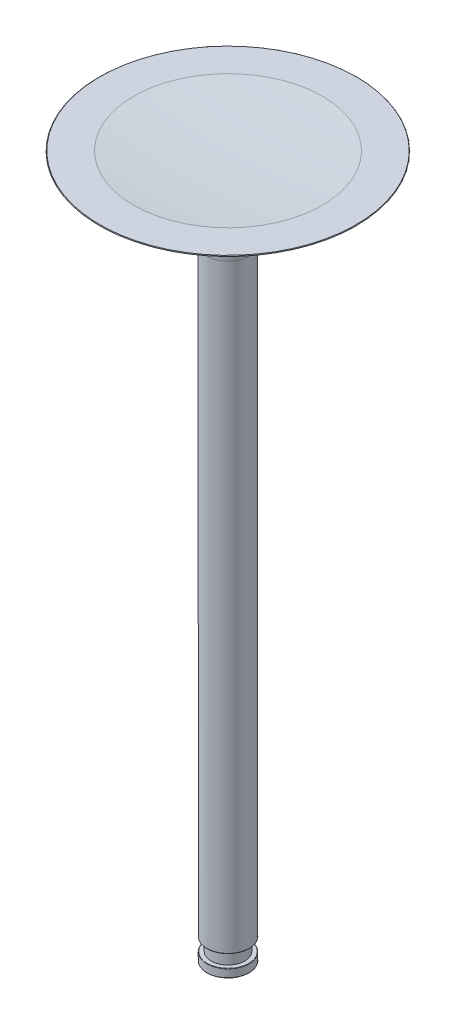
ISO-10303-21;
HEADER;
FILE_DESCRIPTION(('STEP AP214'),'2;1');
FILE_NAME('part.step','',(''),(''),'','','');
FILE_SCHEMA(('AUTOMOTIVE_DESIGN { 1 0 10303 214 1 1 1 1 }'));
ENDSEC;
DATA;
#1=APPLICATION_CONTEXT('core data for automotive mechanical design processes');
#2=APPLICATION_PROTOCOL_DEFINITION('international standard','automotive_design',2000,#1);
#3=PRODUCT_CONTEXT('',#1,'mechanical');
#4=PRODUCT('Part','Part','',(#3));
#5=PRODUCT_RELATED_PRODUCT_CATEGORY('part','',(#4));
#6=PRODUCT_DEFINITION_FORMATION('','',#4);
#7=PRODUCT_DEFINITION_CONTEXT('part definition',#1,'design');
#8=PRODUCT_DEFINITION('design','',#6,#7);
#9=PRODUCT_DEFINITION_SHAPE('','',#8);
#10=(LENGTH_UNIT() NAMED_UNIT(*) SI_UNIT(.MILLI.,.METRE.));
#11=(NAMED_UNIT(*) PLANE_ANGLE_UNIT() SI_UNIT($,.RADIAN.));
#12=(NAMED_UNIT(*) SI_UNIT($,.STERADIAN.) SOLID_ANGLE_UNIT());
#13=UNCERTAINTY_MEASURE_WITH_UNIT(LENGTH_MEASURE(1.E-05),#10,'distance_accuracy_value','');
#14=(GEOMETRIC_REPRESENTATION_CONTEXT(3) GLOBAL_UNCERTAINTY_ASSIGNED_CONTEXT((#13)) GLOBAL_UNIT_ASSIGNED_CONTEXT((#10,
#11,#12)) REPRESENTATION_CONTEXT('',''));
#15=CARTESIAN_POINT('',(0.,0.,0.));
#16=DIRECTION('',(0.,0.,1.));
#17=DIRECTION('',(1.,0.,0.));
#18=AXIS2_PLACEMENT_3D('',#15,#16,#17);
#19=CARTESIAN_POINT('',(0.,83.312,0.));
#20=DIRECTION('',(0.,-1.,0.));
#21=DIRECTION('',(0.,0.,-1.));
#22=AXIS2_PLACEMENT_3D('',#19,#20,#21);
#23=PLANE('',#22);
#24=CARTESIAN_POINT('',(0.,83.312,0.));
#25=DIRECTION('',(0.,-1.,0.));
#26=DIRECTION('',(0.,0.,-1.));
#27=AXIS2_PLACEMENT_3D('',#24,#25,#26);
#28=CIRCLE('',#27,15.2132739148693);
#29=CARTESIAN_POINT('',(0.,83.312,-15.2132739148693));
#30=VERTEX_POINT('',#29);
#31=EDGE_CURVE('E46',#30,#30,#28,.F.);
#32=ORIENTED_EDGE('',*,*,#31,.T.);
#33=EDGE_LOOP('',(#32));
#34=FACE_BOUND('',#33,.T.);
#35=CARTESIAN_POINT('',(0.,83.312,0.));
#36=DIRECTION('',(0.,-1.,0.));
#37=DIRECTION('',(0.,0.,-1.));
#38=AXIS2_PLACEMENT_3D('',#35,#36,#37);
#39=CIRCLE('',#38,11.2132739148693);
#40=CARTESIAN_POINT('',(0.,83.312,-11.2132739148693));
#41=VERTEX_POINT('',#40);
#42=EDGE_CURVE('E10',#41,#41,#39,.F.);
#43=ORIENTED_EDGE('',*,*,#42,.F.);
#44=EDGE_LOOP('',(#43));
#45=FACE_BOUND('',#44,.T.);
#46=ADVANCED_FACE('F38',(#34,#45),#23,.F.);
#47=CARTESIAN_POINT('',(-2.49999999999999,0.,0.));
#48=DIRECTION('',(0.,1.,0.));
#49=DIRECTION('',(0.,0.,1.));
#50=AXIS2_PLACEMENT_3D('',#47,#48,#49);
#51=PLANE('',#50);
#52=CARTESIAN_POINT('',(0.,0.,0.));
#53=DIRECTION('',(0.,1.,0.));
#54=DIRECTION('',(0.,0.,1.));
#55=AXIS2_PLACEMENT_3D('',#52,#53,#54);
#56=CIRCLE('',#55,2.44999999999999);
#57=CARTESIAN_POINT('',(0.,0.,2.44999999999999));
#58=VERTEX_POINT('',#57);
#59=EDGE_CURVE('E56',#58,#58,#56,.F.);
#60=ORIENTED_EDGE('',*,*,#59,.T.);
#61=EDGE_LOOP('',(#60));
#62=FACE_BOUND('',#61,.T.);
#63=ADVANCED_FACE('F110',(#62),#51,.F.);
#64=CARTESIAN_POINT('',(0.,208.799511889888,0.));
#65=DIRECTION('',(0.,0.,1.));
#66=DIRECTION('',(1.,0.,0.));
#67=AXIS2_PLACEMENT_3D('',#64,#65,#66);
#68=SPHERICAL_SURFACE('',#67,125.987511889888);
#69=CARTESIAN_POINT('',(0.,208.799511889888,0.));
#70=DIRECTION('',(0.,-1.,0.));
#71=DIRECTION('',(0.,0.,-1.));
#72=AXIS2_PLACEMENT_3D('',#69,#70,#71);
#73=SPHERICAL_SURFACE('',#72,125.987511889888);
#74=ORIENTED_EDGE('',*,*,#42,.T.);
#75=EDGE_LOOP('',(#74));
#76=FACE_BOUND('',#75,.T.);
#77=ADVANCED_FACE('F40',(#76),#73,.F.);
#78=CARTESIAN_POINT('',(0.,119.029206452911,0.));
#79=DIRECTION('',(0.,-1.,0.));
#80=DIRECTION('',(0.,0.,-1.));
#81=AXIS2_PLACEMENT_3D('',#78,#79,#80);
#82=DEGENERATE_TOROIDAL_SURFACE('',#81,2.50000000000001,38.0094572021208,.T.);
#83=CARTESIAN_POINT('',(0.,83.2148876213081,0.));
#84=DIRECTION('',(0.,1.,0.));
#85=DIRECTION('',(0.,0.,1.));
#86=AXIS2_PLACEMENT_3D('',#83,#84,#85);
#87=CIRCLE('',#86,15.2300197732824);
#88=CARTESIAN_POINT('',(0.,83.2148876213081,15.2300197732824));
#89=VERTEX_POINT('',#88);
#90=EDGE_CURVE('E52',#89,#89,#87,.F.);
#91=ORIENTED_EDGE('',*,*,#90,.T.);
#92=EDGE_LOOP('',(#91));
#93=FACE_BOUND('',#92,.T.);
#94=CARTESIAN_POINT('',(0.,81.5987349281267,0.));
#95=DIRECTION('',(0.,-1.,0.));
#96=DIRECTION('',(0.,0.,-1.));
#97=AXIS2_PLACEMENT_3D('',#94,#95,#96);
#98=CIRCLE('',#97,9.10898163351838);
#99=CARTESIAN_POINT('',(0.,81.5987349281267,-9.10898163351838));
#100=VERTEX_POINT('',#99);
#101=EDGE_CURVE('E76',#100,#100,#98,.T.);
#102=ORIENTED_EDGE('',*,*,#101,.F.);
#103=EDGE_LOOP('',(#102));
#104=FACE_BOUND('',#103,.T.);
#105=ADVANCED_FACE('F121',(#93,#104),#82,.T.);
#106=CARTESIAN_POINT('',(0.,73.7205963215706,0.));
#107=DIRECTION('',(0.,-1.,0.));
#108=DIRECTION('',(0.,0.,-1.));
#109=AXIS2_PLACEMENT_3D('',#106,#107,#108);
#110=TOROIDAL_SURFACE('',#109,10.5,8.);
#111=CARTESIAN_POINT('',(0.,73.7205963215706,0.));
#112=DIRECTION('',(0.,-1.,0.));
#113=DIRECTION('',(0.,0.,-1.));
#114=AXIS2_PLACEMENT_3D('',#111,#112,#113);
#115=CIRCLE('',#114,2.5);
#116=CARTESIAN_POINT('',(0.,73.7205963215706,-2.5));
#117=VERTEX_POINT('',#116);
#118=EDGE_CURVE('E79',#117,#117,#115,.T.);
#119=ORIENTED_EDGE('',*,*,#118,.F.);
#120=EDGE_LOOP('',(#119));
#121=FACE_BOUND('',#120,.T.);
#122=ORIENTED_EDGE('',*,*,#101,.T.);
#123=EDGE_LOOP('',(#122));
#124=FACE_BOUND('',#123,.T.);
#125=ADVANCED_FACE('F106',(#121,#124),#110,.F.);
#126=CARTESIAN_POINT('',(0.,0.,0.));
#127=DIRECTION('',(0.,-1.,0.));
#128=DIRECTION('',(0.,0.,-1.));
#129=AXIS2_PLACEMENT_3D('',#126,#127,#128);
#130=CYLINDRICAL_SURFACE('',#129,2.5);
#131=CARTESIAN_POINT('',(0.,2.55,0.));
#132=DIRECTION('',(0.,1.,0.));
#133=DIRECTION('',(0.,0.,1.));
#134=AXIS2_PLACEMENT_3D('',#131,#132,#133);
#135=CIRCLE('',#134,2.5);
#136=CARTESIAN_POINT('',(0.,2.55,2.5));
#137=VERTEX_POINT('',#136);
#138=EDGE_CURVE('E70',#137,#137,#135,.T.);
#139=ORIENTED_EDGE('',*,*,#138,.T.);
#140=EDGE_LOOP('',(#139));
#141=FACE_BOUND('',#140,.T.);
#142=ORIENTED_EDGE('',*,*,#118,.T.);
#143=EDGE_LOOP('',(#142));
#144=FACE_BOUND('',#143,.T.);
#145=ADVANCED_FACE('F99',(#141,#144),#130,.T.);
#146=CARTESIAN_POINT('',(-2.5,2.5,0.));
#147=DIRECTION('',(0.,1.,0.));
#148=DIRECTION('',(0.,0.,1.));
#149=AXIS2_PLACEMENT_3D('',#146,#147,#148);
#150=PLANE('',#149);
#151=CARTESIAN_POINT('',(0.,2.5,0.));
#152=DIRECTION('',(0.,1.,0.));
#153=DIRECTION('',(0.,0.,1.));
#154=AXIS2_PLACEMENT_3D('',#151,#152,#153);
#155=CIRCLE('',#154,2.45);
#156=CARTESIAN_POINT('',(0.,2.5,2.45));
#157=VERTEX_POINT('',#156);
#158=EDGE_CURVE('E73',#157,#157,#155,.F.);
#159=ORIENTED_EDGE('',*,*,#158,.T.);
#160=EDGE_LOOP('',(#159));
#161=FACE_BOUND('',#160,.T.);
#162=CARTESIAN_POINT('',(0.,2.5,0.));
#163=DIRECTION('',(0.,-1.,0.));
#164=DIRECTION('',(0.,0.,-1.));
#165=AXIS2_PLACEMENT_3D('',#162,#163,#164);
#166=CIRCLE('',#165,1.99999999999999);
#167=CARTESIAN_POINT('',(0.,2.5,-1.99999999999999));
#168=VERTEX_POINT('',#167);
#169=EDGE_CURVE('E82',#168,#168,#166,.T.);
#170=ORIENTED_EDGE('',*,*,#169,.F.);
#171=EDGE_LOOP('',(#170));
#172=FACE_BOUND('',#171,.T.);
#173=ADVANCED_FACE('F94',(#161,#172),#150,.F.);
#174=CARTESIAN_POINT('',(0.,0.,0.));
#175=DIRECTION('',(0.,-1.,0.));
#176=DIRECTION('',(0.,0.,-1.));
#177=AXIS2_PLACEMENT_3D('',#174,#175,#176);
#178=CYLINDRICAL_SURFACE('',#177,1.99999999999999);
#179=CARTESIAN_POINT('',(0.,1.,0.));
#180=DIRECTION('',(0.,-1.,0.));
#181=DIRECTION('',(0.,0.,-1.));
#182=AXIS2_PLACEMENT_3D('',#179,#180,#181);
#183=CIRCLE('',#182,1.99999999999999);
#184=CARTESIAN_POINT('',(0.,1.,-1.99999999999999));
#185=VERTEX_POINT('',#184);
#186=EDGE_CURVE('E85',#185,#185,#183,.T.);
#187=ORIENTED_EDGE('',*,*,#186,.F.);
#188=EDGE_LOOP('',(#187));
#189=FACE_BOUND('',#188,.T.);
#190=ORIENTED_EDGE('',*,*,#169,.T.);
#191=EDGE_LOOP('',(#190));
#192=FACE_BOUND('',#191,.T.);
#193=ADVANCED_FACE('F91',(#189,#192),#178,.T.);
#194=CARTESIAN_POINT('',(-1.99999999999999,1.,0.));
#195=DIRECTION('',(0.,-1.,0.));
#196=DIRECTION('',(0.,0.,-1.));
#197=AXIS2_PLACEMENT_3D('',#194,#195,#196);
#198=PLANE('',#197);
#199=CARTESIAN_POINT('',(0.,1.,0.));
#200=DIRECTION('',(0.,-1.,0.));
#201=DIRECTION('',(0.,0.,-1.));
#202=AXIS2_PLACEMENT_3D('',#199,#200,#201);
#203=CIRCLE('',#202,2.44999999999999);
#204=CARTESIAN_POINT('',(0.,1.,-2.44999999999999));
#205=VERTEX_POINT('',#204);
#206=EDGE_CURVE('E61',#205,#205,#203,.F.);
#207=ORIENTED_EDGE('',*,*,#206,.T.);
#208=EDGE_LOOP('',(#207));
#209=FACE_BOUND('',#208,.T.);
#210=ORIENTED_EDGE('',*,*,#186,.T.);
#211=EDGE_LOOP('',(#210));
#212=FACE_BOUND('',#211,.T.);
#213=ADVANCED_FACE('F89',(#209,#212),#198,.F.);
#214=CARTESIAN_POINT('',(0.,0.,0.));
#215=DIRECTION('',(0.,-1.,0.));
#216=DIRECTION('',(0.,0.,-1.));
#217=AXIS2_PLACEMENT_3D('',#214,#215,#216);
#218=CYLINDRICAL_SURFACE('',#217,2.49999999999999);
#219=CARTESIAN_POINT('',(0.,0.95,0.));
#220=DIRECTION('',(0.,-1.,0.));
#221=DIRECTION('',(0.,0.,-1.));
#222=AXIS2_PLACEMENT_3D('',#219,#220,#221);
#223=CIRCLE('',#222,2.49999999999999);
#224=CARTESIAN_POINT('',(0.,0.95,-2.49999999999999));
#225=VERTEX_POINT('',#224);
#226=EDGE_CURVE('E64',#225,#225,#223,.T.);
#227=ORIENTED_EDGE('',*,*,#226,.T.);
#228=EDGE_LOOP('',(#227));
#229=FACE_BOUND('',#228,.T.);
#230=CARTESIAN_POINT('',(0.,0.05,0.));
#231=DIRECTION('',(0.,1.,0.));
#232=DIRECTION('',(0.,0.,1.));
#233=AXIS2_PLACEMENT_3D('',#230,#231,#232);
#234=CIRCLE('',#233,2.49999999999999);
#235=CARTESIAN_POINT('',(0.,0.05,2.49999999999999));
#236=VERTEX_POINT('',#235);
#237=EDGE_CURVE('E67',#236,#236,#234,.T.);
#238=ORIENTED_EDGE('',*,*,#237,.T.);
#239=EDGE_LOOP('',(#238));
#240=FACE_BOUND('',#239,.T.);
#241=ADVANCED_FACE('F128',(#229,#240),#218,.T.);
#242=CARTESIAN_POINT('',(0.,2.55,0.));
#243=DIRECTION('',(0.,1.,0.));
#244=DIRECTION('',(0.,0.,1.));
#245=AXIS2_PLACEMENT_3D('',#242,#243,#244);
#246=TOROIDAL_SURFACE('',#245,2.45,0.05);
#247=ORIENTED_EDGE('',*,*,#138,.F.);
#248=EDGE_LOOP('',(#247));
#249=FACE_BOUND('',#248,.T.);
#250=ORIENTED_EDGE('',*,*,#158,.F.);
#251=EDGE_LOOP('',(#250));
#252=FACE_BOUND('',#251,.T.);
#253=ADVANCED_FACE('F124',(#249,#252),#246,.T.);
#254=CARTESIAN_POINT('',(0.,0.95,0.));
#255=DIRECTION('',(0.,-1.,0.));
#256=DIRECTION('',(0.,0.,-1.));
#257=AXIS2_PLACEMENT_3D('',#254,#255,#256);
#258=TOROIDAL_SURFACE('',#257,2.44999999999999,0.05);
#259=ORIENTED_EDGE('',*,*,#206,.F.);
#260=EDGE_LOOP('',(#259));
#261=FACE_BOUND('',#260,.T.);
#262=ORIENTED_EDGE('',*,*,#226,.F.);
#263=EDGE_LOOP('',(#262));
#264=FACE_BOUND('',#263,.T.);
#265=ADVANCED_FACE('F127',(#261,#264),#258,.T.);
#266=CARTESIAN_POINT('',(0.,0.05,0.));
#267=DIRECTION('',(0.,1.,0.));
#268=DIRECTION('',(0.,0.,1.));
#269=AXIS2_PLACEMENT_3D('',#266,#267,#268);
#270=TOROIDAL_SURFACE('',#269,2.44999999999999,0.05);
#271=ORIENTED_EDGE('',*,*,#237,.F.);
#272=EDGE_LOOP('',(#271));
#273=FACE_BOUND('',#272,.T.);
#274=ORIENTED_EDGE('',*,*,#59,.F.);
#275=EDGE_LOOP('',(#274));
#276=FACE_BOUND('',#275,.T.);
#277=ADVANCED_FACE('F132',(#273,#276),#270,.T.);
#278=CARTESIAN_POINT('',(0.,83.262,0.));
#279=DIRECTION('',(0.,-1.,0.));
#280=DIRECTION('',(0.,0.,-1.));
#281=AXIS2_PLACEMENT_3D('',#278,#279,#280);
#282=TOROIDAL_SURFACE('',#281,15.2132739148693,0.05);
#283=ORIENTED_EDGE('',*,*,#31,.F.);
#284=EDGE_LOOP('',(#283));
#285=FACE_BOUND('',#284,.T.);
#286=ORIENTED_EDGE('',*,*,#90,.F.);
#287=EDGE_LOOP('',(#286));
#288=FACE_BOUND('',#287,.T.);
#289=ADVANCED_FACE('F135',(#285,#288),#282,.T.);
#290=CLOSED_SHELL('',(#46,#63,#77,#105,#125,#145,#173,#193,#213,#241,#253,#265,#277,#289));
#291=MANIFOLD_SOLID_BREP('B2',#290);
#292=ADVANCED_BREP_SHAPE_REPRESENTATION('',(#18,#291),#14);
#293=SHAPE_DEFINITION_REPRESENTATION(#9,#292);
ENDSEC;
END-ISO-10303-21;
